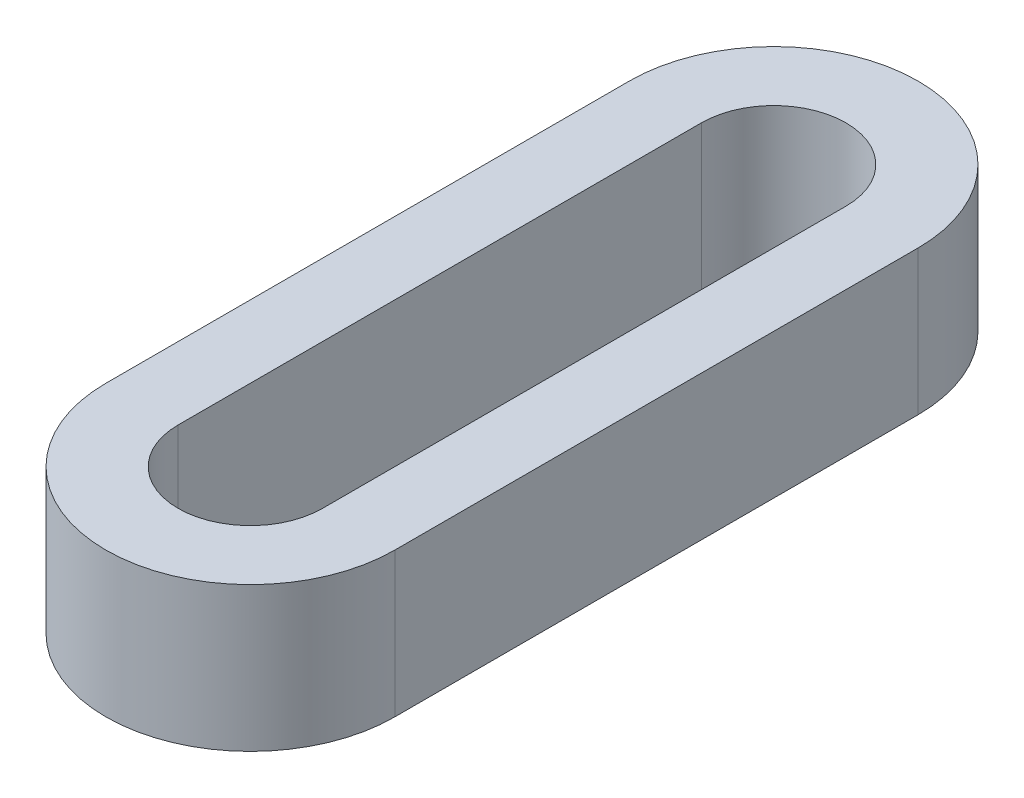
ISO-10303-21;
HEADER;
FILE_DESCRIPTION(('STEP AP214'),'2;1');
FILE_NAME('part.step','',(''),(''),'','','');
FILE_SCHEMA(('AUTOMOTIVE_DESIGN { 1 0 10303 214 1 1 1 1 }'));
ENDSEC;
DATA;
#1=APPLICATION_CONTEXT('core data for automotive mechanical design processes');
#2=APPLICATION_PROTOCOL_DEFINITION('international standard','automotive_design',2000,#1);
#3=PRODUCT_CONTEXT('',#1,'mechanical');
#4=PRODUCT('Part','Part','',(#3));
#5=PRODUCT_RELATED_PRODUCT_CATEGORY('part','',(#4));
#6=PRODUCT_DEFINITION_FORMATION('','',#4);
#7=PRODUCT_DEFINITION_CONTEXT('part definition',#1,'design');
#8=PRODUCT_DEFINITION('design','',#6,#7);
#9=PRODUCT_DEFINITION_SHAPE('','',#8);
#10=(LENGTH_UNIT() NAMED_UNIT(*) SI_UNIT(.MILLI.,.METRE.));
#11=(NAMED_UNIT(*) PLANE_ANGLE_UNIT() SI_UNIT($,.RADIAN.));
#12=(NAMED_UNIT(*) SI_UNIT($,.STERADIAN.) SOLID_ANGLE_UNIT());
#13=UNCERTAINTY_MEASURE_WITH_UNIT(LENGTH_MEASURE(1.E-05),#10,'distance_accuracy_value','');
#14=(GEOMETRIC_REPRESENTATION_CONTEXT(3) GLOBAL_UNCERTAINTY_ASSIGNED_CONTEXT((#13)) GLOBAL_UNIT_ASSIGNED_CONTEXT((#10,
#11,#12)) REPRESENTATION_CONTEXT('',''));
#15=CARTESIAN_POINT('',(0.,0.,0.));
#16=DIRECTION('',(0.,0.,1.));
#17=DIRECTION('',(1.,0.,0.));
#18=AXIS2_PLACEMENT_3D('',#15,#16,#17);
#19=CARTESIAN_POINT('',(0.,5.,-9.05652354678636));
#20=DIRECTION('',(0.,-1.,0.));
#21=DIRECTION('',(0.,0.,-1.));
#22=AXIS2_PLACEMENT_3D('',#19,#20,#21);
#23=PLANE('',#22);
#24=CARTESIAN_POINT('',(0.,5.,-9.05652354678636));
#25=DIRECTION('',(0.,1.,0.));
#26=DIRECTION('',(0.,0.,-1.));
#27=AXIS2_PLACEMENT_3D('',#24,#25,#26);
#28=CIRCLE('',#27,5.);
#29=CARTESIAN_POINT('',(5.,5.,-9.05652354678636));
#30=VERTEX_POINT('',#29);
#31=CARTESIAN_POINT('',(-5.,5.,-9.05652354678636));
#32=VERTEX_POINT('',#31);
#33=EDGE_CURVE('E134',#30,#32,#28,.T.);
#34=ORIENTED_EDGE('',*,*,#33,.T.);
#35=DIRECTION('',(0.,0.,1.));
#36=VECTOR('',#35,1.);
#37=CARTESIAN_POINT('',(-5.,5.,9.05652354678636));
#38=LINE('',#37,#36);
#39=CARTESIAN_POINT('',(-5.,5.,9.05652354678636));
#40=VERTEX_POINT('',#39);
#41=EDGE_CURVE('E137',#32,#40,#38,.T.);
#42=ORIENTED_EDGE('',*,*,#41,.T.);
#43=CARTESIAN_POINT('',(0.,5.,9.05652354678636));
#44=DIRECTION('',(0.,1.,0.));
#45=DIRECTION('',(0.,0.,1.));
#46=AXIS2_PLACEMENT_3D('',#43,#44,#45);
#47=CIRCLE('',#46,5.);
#48=CARTESIAN_POINT('',(5.,5.,9.05652354678636));
#49=VERTEX_POINT('',#48);
#50=EDGE_CURVE('E140',#40,#49,#47,.T.);
#51=ORIENTED_EDGE('',*,*,#50,.T.);
#52=DIRECTION('',(0.,0.,-1.));
#53=VECTOR('',#52,1.);
#54=CARTESIAN_POINT('',(5.,5.,9.05652354678636));
#55=LINE('',#54,#53);
#56=EDGE_CURVE('E142',#49,#30,#55,.T.);
#57=ORIENTED_EDGE('',*,*,#56,.T.);
#58=EDGE_LOOP('',(#34,#42,#51,#57));
#59=FACE_BOUND('',#58,.T.);
#60=CARTESIAN_POINT('',(0.,5.,9.05652354678636));
#61=DIRECTION('',(0.,1.,0.));
#62=DIRECTION('',(0.,0.,1.));
#63=AXIS2_PLACEMENT_3D('',#60,#61,#62);
#64=CIRCLE('',#63,2.5);
#65=CARTESIAN_POINT('',(-2.5,5.,9.05652354678635));
#66=VERTEX_POINT('',#65);
#67=CARTESIAN_POINT('',(2.5,5.,9.05652354678635));
#68=VERTEX_POINT('',#67);
#69=EDGE_CURVE('E98',#66,#68,#64,.T.);
#70=ORIENTED_EDGE('',*,*,#69,.F.);
#71=DIRECTION('',(0.,0.,1.));
#72=VECTOR('',#71,1.);
#73=CARTESIAN_POINT('',(-2.5,5.,9.05652354678635));
#74=LINE('',#73,#72);
#75=CARTESIAN_POINT('',(-2.5,5.,-9.05652354678635));
#76=VERTEX_POINT('',#75);
#77=EDGE_CURVE('E120',#76,#66,#74,.T.);
#78=ORIENTED_EDGE('',*,*,#77,.F.);
#79=CARTESIAN_POINT('',(0.,5.,-9.05652354678636));
#80=DIRECTION('',(0.,1.,0.));
#81=DIRECTION('',(0.,0.,1.));
#82=AXIS2_PLACEMENT_3D('',#79,#80,#81);
#83=CIRCLE('',#82,2.5);
#84=CARTESIAN_POINT('',(2.5,5.,-9.05652354678635));
#85=VERTEX_POINT('',#84);
#86=EDGE_CURVE('E118',#85,#76,#83,.T.);
#87=ORIENTED_EDGE('',*,*,#86,.F.);
#88=DIRECTION('',(0.,0.,-1.));
#89=VECTOR('',#88,1.);
#90=CARTESIAN_POINT('',(2.5,5.,9.05652354678635));
#91=LINE('',#90,#89);
#92=EDGE_CURVE('E106',#68,#85,#91,.T.);
#93=ORIENTED_EDGE('',*,*,#92,.F.);
#94=EDGE_LOOP('',(#70,#78,#87,#93));
#95=FACE_BOUND('',#94,.T.);
#96=ADVANCED_FACE('F33',(#59,#95),#23,.F.);
#97=CARTESIAN_POINT('',(0.,0.,-9.05652354678636));
#98=DIRECTION('',(0.,-1.,0.));
#99=DIRECTION('',(0.,0.,-1.));
#100=AXIS2_PLACEMENT_3D('',#97,#98,#99);
#101=PLANE('',#100);
#102=CARTESIAN_POINT('',(0.,0.,-9.05652354678636));
#103=DIRECTION('',(0.,1.,0.));
#104=DIRECTION('',(0.,0.,-1.));
#105=AXIS2_PLACEMENT_3D('',#102,#103,#104);
#106=CIRCLE('',#105,5.);
#107=CARTESIAN_POINT('',(5.,0.,-9.05652354678636));
#108=VERTEX_POINT('',#107);
#109=CARTESIAN_POINT('',(-5.,0.,-9.05652354678636));
#110=VERTEX_POINT('',#109);
#111=EDGE_CURVE('E114',#108,#110,#106,.T.);
#112=ORIENTED_EDGE('',*,*,#111,.F.);
#113=DIRECTION('',(0.,0.,-1.));
#114=VECTOR('',#113,1.);
#115=CARTESIAN_POINT('',(5.,0.,9.05652354678636));
#116=LINE('',#115,#114);
#117=CARTESIAN_POINT('',(5.,0.,9.05652354678636));
#118=VERTEX_POINT('',#117);
#119=EDGE_CURVE('E138',#118,#108,#116,.T.);
#120=ORIENTED_EDGE('',*,*,#119,.F.);
#121=CARTESIAN_POINT('',(0.,0.,9.05652354678636));
#122=DIRECTION('',(0.,1.,0.));
#123=DIRECTION('',(0.,0.,1.));
#124=AXIS2_PLACEMENT_3D('',#121,#122,#123);
#125=CIRCLE('',#124,5.);
#126=CARTESIAN_POINT('',(-5.,0.,9.05652354678636));
#127=VERTEX_POINT('',#126);
#128=EDGE_CURVE('E149',#127,#118,#125,.T.);
#129=ORIENTED_EDGE('',*,*,#128,.F.);
#130=DIRECTION('',(0.,0.,1.));
#131=VECTOR('',#130,1.);
#132=CARTESIAN_POINT('',(-5.,0.,9.05652354678636));
#133=LINE('',#132,#131);
#134=EDGE_CURVE('E147',#110,#127,#133,.T.);
#135=ORIENTED_EDGE('',*,*,#134,.F.);
#136=EDGE_LOOP('',(#112,#120,#129,#135));
#137=FACE_BOUND('',#136,.T.);
#138=DIRECTION('',(0.,0.,1.));
#139=VECTOR('',#138,1.);
#140=CARTESIAN_POINT('',(-2.5,0.,9.05652354678635));
#141=LINE('',#140,#139);
#142=CARTESIAN_POINT('',(-2.5,0.,-9.05652354678635));
#143=VERTEX_POINT('',#142);
#144=CARTESIAN_POINT('',(-2.5,0.,9.05652354678635));
#145=VERTEX_POINT('',#144);
#146=EDGE_CURVE('E107',#143,#145,#141,.T.);
#147=ORIENTED_EDGE('',*,*,#146,.T.);
#148=CARTESIAN_POINT('',(0.,0.,9.05652354678636));
#149=DIRECTION('',(0.,1.,0.));
#150=DIRECTION('',(0.,0.,1.));
#151=AXIS2_PLACEMENT_3D('',#148,#149,#150);
#152=CIRCLE('',#151,2.5);
#153=CARTESIAN_POINT('',(2.5,0.,9.05652354678635));
#154=VERTEX_POINT('',#153);
#155=EDGE_CURVE('E56',#145,#154,#152,.T.);
#156=ORIENTED_EDGE('',*,*,#155,.T.);
#157=DIRECTION('',(0.,0.,-1.));
#158=VECTOR('',#157,1.);
#159=CARTESIAN_POINT('',(2.5,0.,9.05652354678635));
#160=LINE('',#159,#158);
#161=CARTESIAN_POINT('',(2.5,0.,-9.05652354678635));
#162=VERTEX_POINT('',#161);
#163=EDGE_CURVE('E113',#154,#162,#160,.T.);
#164=ORIENTED_EDGE('',*,*,#163,.T.);
#165=CARTESIAN_POINT('',(0.,0.,-9.05652354678636));
#166=DIRECTION('',(0.,1.,0.));
#167=DIRECTION('',(0.,0.,1.));
#168=AXIS2_PLACEMENT_3D('',#165,#166,#167);
#169=CIRCLE('',#168,2.5);
#170=EDGE_CURVE('E126',#162,#143,#169,.T.);
#171=ORIENTED_EDGE('',*,*,#170,.T.);
#172=EDGE_LOOP('',(#147,#156,#164,#171));
#173=FACE_BOUND('',#172,.T.);
#174=ADVANCED_FACE('F167',(#137,#173),#101,.T.);
#175=CARTESIAN_POINT('',(0.,5.,-9.05652354678636));
#176=DIRECTION('',(0.,-1.,0.));
#177=DIRECTION('',(0.,0.,-1.));
#178=AXIS2_PLACEMENT_3D('',#175,#176,#177);
#179=CYLINDRICAL_SURFACE('',#178,5.);
#180=ORIENTED_EDGE('',*,*,#111,.T.);
#181=DIRECTION('',(0.,-1.,0.));
#182=VECTOR('',#181,1.);
#183=CARTESIAN_POINT('',(-5.,5.,-9.05652354678636));
#184=LINE('',#183,#182);
#185=EDGE_CURVE('E11',#32,#110,#184,.T.);
#186=ORIENTED_EDGE('',*,*,#185,.F.);
#187=ORIENTED_EDGE('',*,*,#33,.F.);
#188=DIRECTION('',(0.,-1.,0.));
#189=VECTOR('',#188,1.);
#190=CARTESIAN_POINT('',(5.,5.,-9.05652354678636));
#191=LINE('',#190,#189);
#192=EDGE_CURVE('E144',#30,#108,#191,.T.);
#193=ORIENTED_EDGE('',*,*,#192,.T.);
#194=EDGE_LOOP('',(#180,#186,#187,#193));
#195=FACE_BOUND('',#194,.T.);
#196=ADVANCED_FACE('F35',(#195),#179,.T.);
#197=CARTESIAN_POINT('',(-5.,5.,9.05652354678636));
#198=DIRECTION('',(1.,0.,0.));
#199=DIRECTION('',(0.,0.,-1.));
#200=AXIS2_PLACEMENT_3D('',#197,#198,#199);
#201=PLANE('',#200);
#202=ORIENTED_EDGE('',*,*,#134,.T.);
#203=DIRECTION('',(0.,-1.,0.));
#204=VECTOR('',#203,1.);
#205=CARTESIAN_POINT('',(-5.,5.,9.05652354678636));
#206=LINE('',#205,#204);
#207=EDGE_CURVE('E41',#40,#127,#206,.T.);
#208=ORIENTED_EDGE('',*,*,#207,.F.);
#209=ORIENTED_EDGE('',*,*,#41,.F.);
#210=ORIENTED_EDGE('',*,*,#185,.T.);
#211=EDGE_LOOP('',(#202,#208,#209,#210));
#212=FACE_BOUND('',#211,.T.);
#213=ADVANCED_FACE('F177',(#212),#201,.F.);
#214=CARTESIAN_POINT('',(0.,5.,9.05652354678636));
#215=DIRECTION('',(0.,-1.,0.));
#216=DIRECTION('',(0.,0.,-1.));
#217=AXIS2_PLACEMENT_3D('',#214,#215,#216);
#218=CYLINDRICAL_SURFACE('',#217,5.);
#219=ORIENTED_EDGE('',*,*,#128,.T.);
#220=DIRECTION('',(0.,-1.,0.));
#221=VECTOR('',#220,1.);
#222=CARTESIAN_POINT('',(5.,5.,9.05652354678636));
#223=LINE('',#222,#221);
#224=EDGE_CURVE('E154',#49,#118,#223,.T.);
#225=ORIENTED_EDGE('',*,*,#224,.F.);
#226=ORIENTED_EDGE('',*,*,#50,.F.);
#227=ORIENTED_EDGE('',*,*,#207,.T.);
#228=EDGE_LOOP('',(#219,#225,#226,#227));
#229=FACE_BOUND('',#228,.T.);
#230=ADVANCED_FACE('F161',(#229),#218,.T.);
#231=CARTESIAN_POINT('',(5.,5.,9.05652354678636));
#232=DIRECTION('',(-1.,0.,0.));
#233=DIRECTION('',(0.,0.,1.));
#234=AXIS2_PLACEMENT_3D('',#231,#232,#233);
#235=PLANE('',#234);
#236=ORIENTED_EDGE('',*,*,#119,.T.);
#237=ORIENTED_EDGE('',*,*,#192,.F.);
#238=ORIENTED_EDGE('',*,*,#56,.F.);
#239=ORIENTED_EDGE('',*,*,#224,.T.);
#240=EDGE_LOOP('',(#236,#237,#238,#239));
#241=FACE_BOUND('',#240,.T.);
#242=ADVANCED_FACE('F171',(#241),#235,.F.);
#243=CARTESIAN_POINT('',(0.,5.,9.05652354678636));
#244=DIRECTION('',(0.,-1.,0.));
#245=DIRECTION('',(0.,0.,-1.));
#246=AXIS2_PLACEMENT_3D('',#243,#244,#245);
#247=CYLINDRICAL_SURFACE('',#246,2.5);
#248=ORIENTED_EDGE('',*,*,#155,.F.);
#249=DIRECTION('',(0.,-1.,0.));
#250=VECTOR('',#249,1.);
#251=CARTESIAN_POINT('',(-2.5,5.,9.05652354678635));
#252=LINE('',#251,#250);
#253=EDGE_CURVE('E102',#66,#145,#252,.T.);
#254=ORIENTED_EDGE('',*,*,#253,.F.);
#255=ORIENTED_EDGE('',*,*,#69,.T.);
#256=DIRECTION('',(0.,-1.,0.));
#257=VECTOR('',#256,1.);
#258=CARTESIAN_POINT('',(2.5,5.,9.05652354678635));
#259=LINE('',#258,#257);
#260=EDGE_CURVE('E101',#68,#154,#259,.T.);
#261=ORIENTED_EDGE('',*,*,#260,.T.);
#262=EDGE_LOOP('',(#248,#254,#255,#261));
#263=FACE_BOUND('',#262,.T.);
#264=ADVANCED_FACE('F100',(#263),#247,.F.);
#265=CARTESIAN_POINT('',(2.5,5.,9.05652354678635));
#266=DIRECTION('',(-1.,0.,0.));
#267=DIRECTION('',(0.,0.,1.));
#268=AXIS2_PLACEMENT_3D('',#265,#266,#267);
#269=PLANE('',#268);
#270=ORIENTED_EDGE('',*,*,#163,.F.);
#271=ORIENTED_EDGE('',*,*,#260,.F.);
#272=ORIENTED_EDGE('',*,*,#92,.T.);
#273=DIRECTION('',(0.,-1.,0.));
#274=VECTOR('',#273,1.);
#275=CARTESIAN_POINT('',(2.5,5.,-9.05652354678635));
#276=LINE('',#275,#274);
#277=EDGE_CURVE('E115',#85,#162,#276,.T.);
#278=ORIENTED_EDGE('',*,*,#277,.T.);
#279=EDGE_LOOP('',(#270,#271,#272,#278));
#280=FACE_BOUND('',#279,.T.);
#281=ADVANCED_FACE('F110',(#280),#269,.T.);
#282=CARTESIAN_POINT('',(0.,5.,-9.05652354678636));
#283=DIRECTION('',(0.,-1.,0.));
#284=DIRECTION('',(0.,0.,-1.));
#285=AXIS2_PLACEMENT_3D('',#282,#283,#284);
#286=CYLINDRICAL_SURFACE('',#285,2.5);
#287=ORIENTED_EDGE('',*,*,#170,.F.);
#288=ORIENTED_EDGE('',*,*,#277,.F.);
#289=ORIENTED_EDGE('',*,*,#86,.T.);
#290=DIRECTION('',(0.,-1.,0.));
#291=VECTOR('',#290,1.);
#292=CARTESIAN_POINT('',(-2.5,5.,-9.05652354678635));
#293=LINE('',#292,#291);
#294=EDGE_CURVE('E48',#76,#143,#293,.T.);
#295=ORIENTED_EDGE('',*,*,#294,.T.);
#296=EDGE_LOOP('',(#287,#288,#289,#295));
#297=FACE_BOUND('',#296,.T.);
#298=ADVANCED_FACE('F200',(#297),#286,.F.);
#299=CARTESIAN_POINT('',(-2.5,5.,9.05652354678635));
#300=DIRECTION('',(1.,0.,0.));
#301=DIRECTION('',(0.,0.,-1.));
#302=AXIS2_PLACEMENT_3D('',#299,#300,#301);
#303=PLANE('',#302);
#304=ORIENTED_EDGE('',*,*,#146,.F.);
#305=ORIENTED_EDGE('',*,*,#294,.F.);
#306=ORIENTED_EDGE('',*,*,#77,.T.);
#307=ORIENTED_EDGE('',*,*,#253,.T.);
#308=EDGE_LOOP('',(#304,#305,#306,#307));
#309=FACE_BOUND('',#308,.T.);
#310=ADVANCED_FACE('F204',(#309),#303,.T.);
#311=CLOSED_SHELL('',(#96,#174,#196,#213,#230,#242,#264,#281,#298,#310));
#312=MANIFOLD_SOLID_BREP('B2',#311);
#313=ADVANCED_BREP_SHAPE_REPRESENTATION('',(#18,#312),#14);
#314=SHAPE_DEFINITION_REPRESENTATION(#9,#313);
ENDSEC;
END-ISO-10303-21;
